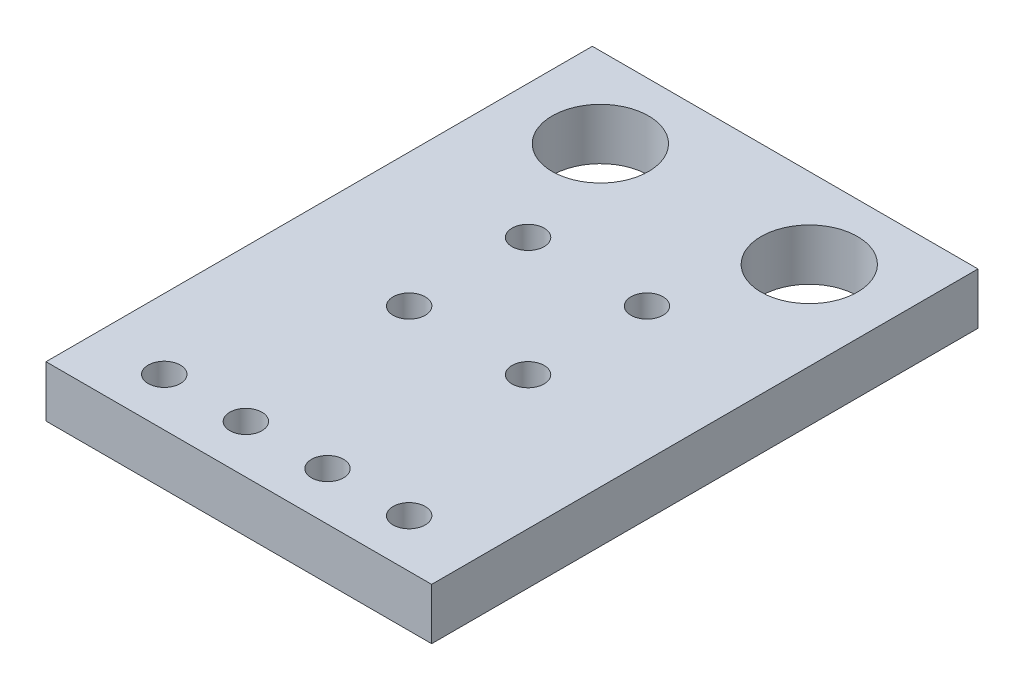
ISO-10303-21;
HEADER;
FILE_DESCRIPTION(('STEP AP214'),'2;1');
FILE_NAME('part.step','',(''),(''),'','','');
FILE_SCHEMA(('AUTOMOTIVE_DESIGN { 1 0 10303 214 1 1 1 1 }'));
ENDSEC;
DATA;
#1=APPLICATION_CONTEXT('core data for automotive mechanical design processes');
#2=APPLICATION_PROTOCOL_DEFINITION('international standard','automotive_design',2000,#1);
#3=PRODUCT_CONTEXT('',#1,'mechanical');
#4=PRODUCT('Part','Part','',(#3));
#5=PRODUCT_RELATED_PRODUCT_CATEGORY('part','',(#4));
#6=PRODUCT_DEFINITION_FORMATION('','',#4);
#7=PRODUCT_DEFINITION_CONTEXT('part definition',#1,'design');
#8=PRODUCT_DEFINITION('design','',#6,#7);
#9=PRODUCT_DEFINITION_SHAPE('','',#8);
#10=(LENGTH_UNIT() NAMED_UNIT(*) SI_UNIT(.MILLI.,.METRE.));
#11=(NAMED_UNIT(*) PLANE_ANGLE_UNIT() SI_UNIT($,.RADIAN.));
#12=(NAMED_UNIT(*) SI_UNIT($,.STERADIAN.) SOLID_ANGLE_UNIT());
#13=UNCERTAINTY_MEASURE_WITH_UNIT(LENGTH_MEASURE(1.E-05),#10,'distance_accuracy_value','');
#14=(GEOMETRIC_REPRESENTATION_CONTEXT(3) GLOBAL_UNCERTAINTY_ASSIGNED_CONTEXT((#13)) GLOBAL_UNIT_ASSIGNED_CONTEXT((#10,
#11,#12)) REPRESENTATION_CONTEXT('',''));
#15=CARTESIAN_POINT('',(0.,0.,0.));
#16=DIRECTION('',(0.,0.,1.));
#17=DIRECTION('',(1.,0.,0.));
#18=AXIS2_PLACEMENT_3D('',#15,#16,#17);
#19=CARTESIAN_POINT('',(0.,1.6,0.));
#20=DIRECTION('',(0.,1.,0.));
#21=DIRECTION('',(0.,0.,1.));
#22=AXIS2_PLACEMENT_3D('',#19,#20,#21);
#23=PLANE('',#22);
#24=CARTESIAN_POINT('',(1.85,1.6,9.85));
#25=DIRECTION('',(0.,1.,0.));
#26=DIRECTION('',(0.,0.,1.));
#27=AXIS2_PLACEMENT_3D('',#24,#25,#26);
#28=CIRCLE('',#27,0.5);
#29=CARTESIAN_POINT('',(1.85,1.6,10.35));
#30=VERTEX_POINT('',#29);
#31=EDGE_CURVE('E165',#30,#30,#28,.T.);
#32=ORIENTED_EDGE('',*,*,#31,.F.);
#33=EDGE_LOOP('',(#32));
#34=FACE_BOUND('',#33,.T.);
#35=CARTESIAN_POINT('',(-1.85,1.6,6.15));
#36=DIRECTION('',(0.,1.,0.));
#37=DIRECTION('',(0.,0.,1.));
#38=AXIS2_PLACEMENT_3D('',#35,#36,#37);
#39=CIRCLE('',#38,0.5);
#40=CARTESIAN_POINT('',(-1.85,1.6,6.65));
#41=VERTEX_POINT('',#40);
#42=EDGE_CURVE('E153',#41,#41,#39,.T.);
#43=ORIENTED_EDGE('',*,*,#42,.F.);
#44=EDGE_LOOP('',(#43));
#45=FACE_BOUND('',#44,.T.);
#46=CARTESIAN_POINT('',(1.26000000000001,1.6,15.5));
#47=DIRECTION('',(0.,1.,0.));
#48=DIRECTION('',(0.,0.,1.));
#49=AXIS2_PLACEMENT_3D('',#46,#47,#48);
#50=CIRCLE('',#49,0.5);
#51=CARTESIAN_POINT('',(1.26000000000001,1.6,16.));
#52=VERTEX_POINT('',#51);
#53=EDGE_CURVE('E141',#52,#52,#50,.T.);
#54=ORIENTED_EDGE('',*,*,#53,.F.);
#55=EDGE_LOOP('',(#54));
#56=FACE_BOUND('',#55,.T.);
#57=CARTESIAN_POINT('',(-3.81999999999999,1.6,15.5));
#58=DIRECTION('',(0.,1.,0.));
#59=DIRECTION('',(0.,0.,1.));
#60=AXIS2_PLACEMENT_3D('',#57,#58,#59);
#61=CIRCLE('',#60,0.500000000000001);
#62=CARTESIAN_POINT('',(-3.81999999999999,1.6,16.));
#63=VERTEX_POINT('',#62);
#64=EDGE_CURVE('E129',#63,#63,#61,.T.);
#65=ORIENTED_EDGE('',*,*,#64,.F.);
#66=EDGE_LOOP('',(#65));
#67=FACE_BOUND('',#66,.T.);
#68=CARTESIAN_POINT('',(-3.25,1.6,2.5));
#69=DIRECTION('',(0.,1.,0.));
#70=DIRECTION('',(0.,0.,1.));
#71=AXIS2_PLACEMENT_3D('',#68,#69,#70);
#72=CIRCLE('',#71,1.5);
#73=CARTESIAN_POINT('',(-3.25,1.6,4.));
#74=VERTEX_POINT('',#73);
#75=EDGE_CURVE('E108',#74,#74,#72,.T.);
#76=ORIENTED_EDGE('',*,*,#75,.F.);
#77=EDGE_LOOP('',(#76));
#78=FACE_BOUND('',#77,.T.);
#79=DIRECTION('',(0.,0.,1.));
#80=VECTOR('',#79,1.);
#81=CARTESIAN_POINT('',(-6.,1.6,0.));
#82=LINE('',#81,#80);
#83=CARTESIAN_POINT('',(-6.,1.6,0.));
#84=VERTEX_POINT('',#83);
#85=CARTESIAN_POINT('',(-6.,1.6,17.));
#86=VERTEX_POINT('',#85);
#87=EDGE_CURVE('E93',#84,#86,#82,.T.);
#88=ORIENTED_EDGE('',*,*,#87,.T.);
#89=DIRECTION('',(1.,0.,0.));
#90=VECTOR('',#89,1.);
#91=CARTESIAN_POINT('',(-6.,1.6,17.));
#92=LINE('',#91,#90);
#93=CARTESIAN_POINT('',(6.00000000000001,1.6,17.));
#94=VERTEX_POINT('',#93);
#95=EDGE_CURVE('E88',#86,#94,#92,.T.);
#96=ORIENTED_EDGE('',*,*,#95,.T.);
#97=DIRECTION('',(0.,0.,-1.));
#98=VECTOR('',#97,1.);
#99=CARTESIAN_POINT('',(6.,1.6,0.));
#100=LINE('',#99,#98);
#101=CARTESIAN_POINT('',(6.,1.6,0.));
#102=VERTEX_POINT('',#101);
#103=EDGE_CURVE('E91',#94,#102,#100,.T.);
#104=ORIENTED_EDGE('',*,*,#103,.T.);
#105=DIRECTION('',(-1.,0.,0.));
#106=VECTOR('',#105,1.);
#107=CARTESIAN_POINT('',(-6.,1.6,0.));
#108=LINE('',#107,#106);
#109=EDGE_CURVE('E58',#102,#84,#108,.T.);
#110=ORIENTED_EDGE('',*,*,#109,.T.);
#111=EDGE_LOOP('',(#88,#96,#104,#110));
#112=FACE_BOUND('',#111,.T.);
#113=CARTESIAN_POINT('',(3.25,1.6,2.5));
#114=DIRECTION('',(0.,1.,0.));
#115=DIRECTION('',(0.,0.,1.));
#116=AXIS2_PLACEMENT_3D('',#113,#114,#115);
#117=CIRCLE('',#116,1.5);
#118=CARTESIAN_POINT('',(3.25,1.6,4.));
#119=VERTEX_POINT('',#118);
#120=EDGE_CURVE('E123',#119,#119,#117,.T.);
#121=ORIENTED_EDGE('',*,*,#120,.F.);
#122=EDGE_LOOP('',(#121));
#123=FACE_BOUND('',#122,.T.);
#124=CARTESIAN_POINT('',(-1.27999999999999,1.6,15.5));
#125=DIRECTION('',(0.,1.,0.));
#126=DIRECTION('',(0.,0.,1.));
#127=AXIS2_PLACEMENT_3D('',#124,#125,#126);
#128=CIRCLE('',#127,0.500000000000002);
#129=CARTESIAN_POINT('',(-1.27999999999999,1.6,16.));
#130=VERTEX_POINT('',#129);
#131=EDGE_CURVE('E135',#130,#130,#128,.T.);
#132=ORIENTED_EDGE('',*,*,#131,.F.);
#133=EDGE_LOOP('',(#132));
#134=FACE_BOUND('',#133,.T.);
#135=CARTESIAN_POINT('',(3.80000000000001,1.6,15.5));
#136=DIRECTION('',(0.,1.,0.));
#137=DIRECTION('',(0.,0.,1.));
#138=AXIS2_PLACEMENT_3D('',#135,#136,#137);
#139=CIRCLE('',#138,0.500000000000002);
#140=CARTESIAN_POINT('',(3.80000000000001,1.6,16.));
#141=VERTEX_POINT('',#140);
#142=EDGE_CURVE('E147',#141,#141,#139,.T.);
#143=ORIENTED_EDGE('',*,*,#142,.F.);
#144=EDGE_LOOP('',(#143));
#145=FACE_BOUND('',#144,.T.);
#146=CARTESIAN_POINT('',(-1.85,1.6,9.85));
#147=DIRECTION('',(0.,1.,0.));
#148=DIRECTION('',(0.,0.,1.));
#149=AXIS2_PLACEMENT_3D('',#146,#147,#148);
#150=CIRCLE('',#149,0.5);
#151=CARTESIAN_POINT('',(-1.85,1.6,10.35));
#152=VERTEX_POINT('',#151);
#153=EDGE_CURVE('E159',#152,#152,#150,.T.);
#154=ORIENTED_EDGE('',*,*,#153,.F.);
#155=EDGE_LOOP('',(#154));
#156=FACE_BOUND('',#155,.T.);
#157=CARTESIAN_POINT('',(1.85,1.6,6.15));
#158=DIRECTION('',(0.,1.,0.));
#159=DIRECTION('',(0.,0.,1.));
#160=AXIS2_PLACEMENT_3D('',#157,#158,#159);
#161=CIRCLE('',#160,0.5);
#162=CARTESIAN_POINT('',(1.85,1.6,6.65));
#163=VERTEX_POINT('',#162);
#164=EDGE_CURVE('E171',#163,#163,#161,.T.);
#165=ORIENTED_EDGE('',*,*,#164,.F.);
#166=EDGE_LOOP('',(#165));
#167=FACE_BOUND('',#166,.T.);
#168=ADVANCED_FACE('F41',(#34,#45,#56,#67,#78,#112,#123,#134,#145,#156,#167),#23,.T.);
#169=CARTESIAN_POINT('',(0.,0.,0.));
#170=DIRECTION('',(0.,1.,0.));
#171=DIRECTION('',(0.,0.,1.));
#172=AXIS2_PLACEMENT_3D('',#169,#170,#171);
#173=PLANE('',#172);
#174=DIRECTION('',(0.,0.,1.));
#175=VECTOR('',#174,1.);
#176=CARTESIAN_POINT('',(-6.,0.,0.));
#177=LINE('',#176,#175);
#178=CARTESIAN_POINT('',(-6.,0.,0.));
#179=VERTEX_POINT('',#178);
#180=CARTESIAN_POINT('',(-6.,0.,17.));
#181=VERTEX_POINT('',#180);
#182=EDGE_CURVE('E105',#179,#181,#177,.T.);
#183=ORIENTED_EDGE('',*,*,#182,.F.);
#184=DIRECTION('',(-1.,0.,0.));
#185=VECTOR('',#184,1.);
#186=CARTESIAN_POINT('',(-6.,0.,0.));
#187=LINE('',#186,#185);
#188=CARTESIAN_POINT('',(6.,0.,0.));
#189=VERTEX_POINT('',#188);
#190=EDGE_CURVE('E81',#189,#179,#187,.T.);
#191=ORIENTED_EDGE('',*,*,#190,.F.);
#192=DIRECTION('',(0.,0.,-1.));
#193=VECTOR('',#192,1.);
#194=CARTESIAN_POINT('',(6.,0.,0.));
#195=LINE('',#194,#193);
#196=CARTESIAN_POINT('',(6.00000000000001,0.,17.));
#197=VERTEX_POINT('',#196);
#198=EDGE_CURVE('E75',#197,#189,#195,.T.);
#199=ORIENTED_EDGE('',*,*,#198,.F.);
#200=DIRECTION('',(1.,0.,0.));
#201=VECTOR('',#200,1.);
#202=CARTESIAN_POINT('',(-6.,0.,17.));
#203=LINE('',#202,#201);
#204=EDGE_CURVE('E97',#181,#197,#203,.T.);
#205=ORIENTED_EDGE('',*,*,#204,.F.);
#206=EDGE_LOOP('',(#183,#191,#199,#205));
#207=FACE_BOUND('',#206,.T.);
#208=CARTESIAN_POINT('',(-3.25,0.,2.5));
#209=DIRECTION('',(0.,1.,0.));
#210=DIRECTION('',(0.,0.,1.));
#211=AXIS2_PLACEMENT_3D('',#208,#209,#210);
#212=CIRCLE('',#211,1.5);
#213=CARTESIAN_POINT('',(-3.25,0.,4.));
#214=VERTEX_POINT('',#213);
#215=EDGE_CURVE('E120',#214,#214,#212,.T.);
#216=ORIENTED_EDGE('',*,*,#215,.T.);
#217=EDGE_LOOP('',(#216));
#218=FACE_BOUND('',#217,.T.);
#219=CARTESIAN_POINT('',(3.25,0.,2.5));
#220=DIRECTION('',(0.,1.,0.));
#221=DIRECTION('',(0.,0.,1.));
#222=AXIS2_PLACEMENT_3D('',#219,#220,#221);
#223=CIRCLE('',#222,1.5);
#224=CARTESIAN_POINT('',(3.25,0.,4.));
#225=VERTEX_POINT('',#224);
#226=EDGE_CURVE('E126',#225,#225,#223,.T.);
#227=ORIENTED_EDGE('',*,*,#226,.T.);
#228=EDGE_LOOP('',(#227));
#229=FACE_BOUND('',#228,.T.);
#230=CARTESIAN_POINT('',(-3.81999999999999,0.,15.5));
#231=DIRECTION('',(0.,1.,0.));
#232=DIRECTION('',(0.,0.,1.));
#233=AXIS2_PLACEMENT_3D('',#230,#231,#232);
#234=CIRCLE('',#233,0.500000000000001);
#235=CARTESIAN_POINT('',(-3.81999999999999,0.,16.));
#236=VERTEX_POINT('',#235);
#237=EDGE_CURVE('E132',#236,#236,#234,.T.);
#238=ORIENTED_EDGE('',*,*,#237,.T.);
#239=EDGE_LOOP('',(#238));
#240=FACE_BOUND('',#239,.T.);
#241=CARTESIAN_POINT('',(-1.27999999999999,0.,15.5));
#242=DIRECTION('',(0.,1.,0.));
#243=DIRECTION('',(0.,0.,1.));
#244=AXIS2_PLACEMENT_3D('',#241,#242,#243);
#245=CIRCLE('',#244,0.500000000000002);
#246=CARTESIAN_POINT('',(-1.27999999999999,0.,16.));
#247=VERTEX_POINT('',#246);
#248=EDGE_CURVE('E138',#247,#247,#245,.T.);
#249=ORIENTED_EDGE('',*,*,#248,.T.);
#250=EDGE_LOOP('',(#249));
#251=FACE_BOUND('',#250,.T.);
#252=CARTESIAN_POINT('',(1.26000000000001,0.,15.5));
#253=DIRECTION('',(0.,1.,0.));
#254=DIRECTION('',(0.,0.,1.));
#255=AXIS2_PLACEMENT_3D('',#252,#253,#254);
#256=CIRCLE('',#255,0.5);
#257=CARTESIAN_POINT('',(1.26000000000001,0.,16.));
#258=VERTEX_POINT('',#257);
#259=EDGE_CURVE('E144',#258,#258,#256,.T.);
#260=ORIENTED_EDGE('',*,*,#259,.T.);
#261=EDGE_LOOP('',(#260));
#262=FACE_BOUND('',#261,.T.);
#263=CARTESIAN_POINT('',(3.80000000000001,0.,15.5));
#264=DIRECTION('',(0.,1.,0.));
#265=DIRECTION('',(0.,0.,1.));
#266=AXIS2_PLACEMENT_3D('',#263,#264,#265);
#267=CIRCLE('',#266,0.500000000000002);
#268=CARTESIAN_POINT('',(3.80000000000001,0.,16.));
#269=VERTEX_POINT('',#268);
#270=EDGE_CURVE('E150',#269,#269,#267,.T.);
#271=ORIENTED_EDGE('',*,*,#270,.T.);
#272=EDGE_LOOP('',(#271));
#273=FACE_BOUND('',#272,.T.);
#274=CARTESIAN_POINT('',(-1.85,0.,6.15));
#275=DIRECTION('',(0.,1.,0.));
#276=DIRECTION('',(0.,0.,1.));
#277=AXIS2_PLACEMENT_3D('',#274,#275,#276);
#278=CIRCLE('',#277,0.5);
#279=CARTESIAN_POINT('',(-1.85,0.,6.65));
#280=VERTEX_POINT('',#279);
#281=EDGE_CURVE('E156',#280,#280,#278,.T.);
#282=ORIENTED_EDGE('',*,*,#281,.T.);
#283=EDGE_LOOP('',(#282));
#284=FACE_BOUND('',#283,.T.);
#285=CARTESIAN_POINT('',(-1.85,0.,9.85));
#286=DIRECTION('',(0.,1.,0.));
#287=DIRECTION('',(0.,0.,1.));
#288=AXIS2_PLACEMENT_3D('',#285,#286,#287);
#289=CIRCLE('',#288,0.5);
#290=CARTESIAN_POINT('',(-1.85,0.,10.35));
#291=VERTEX_POINT('',#290);
#292=EDGE_CURVE('E162',#291,#291,#289,.T.);
#293=ORIENTED_EDGE('',*,*,#292,.T.);
#294=EDGE_LOOP('',(#293));
#295=FACE_BOUND('',#294,.T.);
#296=CARTESIAN_POINT('',(1.85,0.,9.85));
#297=DIRECTION('',(0.,1.,0.));
#298=DIRECTION('',(0.,0.,1.));
#299=AXIS2_PLACEMENT_3D('',#296,#297,#298);
#300=CIRCLE('',#299,0.5);
#301=CARTESIAN_POINT('',(1.85,0.,10.35));
#302=VERTEX_POINT('',#301);
#303=EDGE_CURVE('E168',#302,#302,#300,.T.);
#304=ORIENTED_EDGE('',*,*,#303,.T.);
#305=EDGE_LOOP('',(#304));
#306=FACE_BOUND('',#305,.T.);
#307=CARTESIAN_POINT('',(1.85,0.,6.15));
#308=DIRECTION('',(0.,1.,0.));
#309=DIRECTION('',(0.,0.,1.));
#310=AXIS2_PLACEMENT_3D('',#307,#308,#309);
#311=CIRCLE('',#310,0.5);
#312=CARTESIAN_POINT('',(1.85,0.,6.65));
#313=VERTEX_POINT('',#312);
#314=EDGE_CURVE('E174',#313,#313,#311,.T.);
#315=ORIENTED_EDGE('',*,*,#314,.T.);
#316=EDGE_LOOP('',(#315));
#317=FACE_BOUND('',#316,.T.);
#318=ADVANCED_FACE('F116',(#207,#218,#229,#240,#251,#262,#273,#284,#295,#306,#317),#173,.F.);
#319=CARTESIAN_POINT('',(-6.,1.6,0.));
#320=DIRECTION('',(1.,0.,0.));
#321=DIRECTION('',(0.,0.,-1.));
#322=AXIS2_PLACEMENT_3D('',#319,#320,#321);
#323=PLANE('',#322);
#324=ORIENTED_EDGE('',*,*,#182,.T.);
#325=DIRECTION('',(0.,-1.,0.));
#326=VECTOR('',#325,1.);
#327=CARTESIAN_POINT('',(-6.,1.6,17.));
#328=LINE('',#327,#326);
#329=EDGE_CURVE('E11',#86,#181,#328,.T.);
#330=ORIENTED_EDGE('',*,*,#329,.F.);
#331=ORIENTED_EDGE('',*,*,#87,.F.);
#332=DIRECTION('',(0.,-1.,0.));
#333=VECTOR('',#332,1.);
#334=CARTESIAN_POINT('',(-6.,1.6,0.));
#335=LINE('',#334,#333);
#336=EDGE_CURVE('E101',#84,#179,#335,.T.);
#337=ORIENTED_EDGE('',*,*,#336,.T.);
#338=EDGE_LOOP('',(#324,#330,#331,#337));
#339=FACE_BOUND('',#338,.T.);
#340=ADVANCED_FACE('F43',(#339),#323,.F.);
#341=CARTESIAN_POINT('',(-6.,1.6,17.));
#342=DIRECTION('',(0.,0.,-1.));
#343=DIRECTION('',(-1.,0.,0.));
#344=AXIS2_PLACEMENT_3D('',#341,#342,#343);
#345=PLANE('',#344);
#346=ORIENTED_EDGE('',*,*,#204,.T.);
#347=DIRECTION('',(0.,-1.,0.));
#348=VECTOR('',#347,1.);
#349=CARTESIAN_POINT('',(6.00000000000001,1.6,17.));
#350=LINE('',#349,#348);
#351=EDGE_CURVE('E50',#94,#197,#350,.T.);
#352=ORIENTED_EDGE('',*,*,#351,.F.);
#353=ORIENTED_EDGE('',*,*,#95,.F.);
#354=ORIENTED_EDGE('',*,*,#329,.T.);
#355=EDGE_LOOP('',(#346,#352,#353,#354));
#356=FACE_BOUND('',#355,.T.);
#357=ADVANCED_FACE('F96',(#356),#345,.F.);
#358=CARTESIAN_POINT('',(6.,1.6,0.));
#359=DIRECTION('',(-1.,0.,0.));
#360=DIRECTION('',(0.,0.,1.));
#361=AXIS2_PLACEMENT_3D('',#358,#359,#360);
#362=PLANE('',#361);
#363=ORIENTED_EDGE('',*,*,#198,.T.);
#364=DIRECTION('',(0.,-1.,0.));
#365=VECTOR('',#364,1.);
#366=CARTESIAN_POINT('',(6.,1.6,0.));
#367=LINE('',#366,#365);
#368=EDGE_CURVE('E98',#102,#189,#367,.T.);
#369=ORIENTED_EDGE('',*,*,#368,.F.);
#370=ORIENTED_EDGE('',*,*,#103,.F.);
#371=ORIENTED_EDGE('',*,*,#351,.T.);
#372=EDGE_LOOP('',(#363,#369,#370,#371));
#373=FACE_BOUND('',#372,.T.);
#374=ADVANCED_FACE('F99',(#373),#362,.F.);
#375=CARTESIAN_POINT('',(-6.,1.6,0.));
#376=DIRECTION('',(0.,0.,1.));
#377=DIRECTION('',(1.,0.,0.));
#378=AXIS2_PLACEMENT_3D('',#375,#376,#377);
#379=PLANE('',#378);
#380=ORIENTED_EDGE('',*,*,#190,.T.);
#381=ORIENTED_EDGE('',*,*,#336,.F.);
#382=ORIENTED_EDGE('',*,*,#109,.F.);
#383=ORIENTED_EDGE('',*,*,#368,.T.);
#384=EDGE_LOOP('',(#380,#381,#382,#383));
#385=FACE_BOUND('',#384,.T.);
#386=ADVANCED_FACE('F113',(#385),#379,.F.);
#387=CARTESIAN_POINT('',(-3.25,1.6,2.5));
#388=DIRECTION('',(0.,-1.,0.));
#389=DIRECTION('',(0.,0.,-1.));
#390=AXIS2_PLACEMENT_3D('',#387,#388,#389);
#391=CYLINDRICAL_SURFACE('',#390,1.5);
#392=ORIENTED_EDGE('',*,*,#75,.T.);
#393=EDGE_LOOP('',(#392));
#394=FACE_BOUND('',#393,.T.);
#395=ORIENTED_EDGE('',*,*,#215,.F.);
#396=EDGE_LOOP('',(#395));
#397=FACE_BOUND('',#396,.T.);
#398=ADVANCED_FACE('F193',(#394,#397),#391,.F.);
#399=CARTESIAN_POINT('',(3.25,1.6,2.5));
#400=DIRECTION('',(0.,-1.,0.));
#401=DIRECTION('',(0.,0.,-1.));
#402=AXIS2_PLACEMENT_3D('',#399,#400,#401);
#403=CYLINDRICAL_SURFACE('',#402,1.5);
#404=ORIENTED_EDGE('',*,*,#120,.T.);
#405=EDGE_LOOP('',(#404));
#406=FACE_BOUND('',#405,.T.);
#407=ORIENTED_EDGE('',*,*,#226,.F.);
#408=EDGE_LOOP('',(#407));
#409=FACE_BOUND('',#408,.T.);
#410=ADVANCED_FACE('F256',(#406,#409),#403,.F.);
#411=CARTESIAN_POINT('',(-3.81999999999999,1.6,15.5));
#412=DIRECTION('',(0.,-1.,0.));
#413=DIRECTION('',(0.,0.,-1.));
#414=AXIS2_PLACEMENT_3D('',#411,#412,#413);
#415=CYLINDRICAL_SURFACE('',#414,0.500000000000001);
#416=ORIENTED_EDGE('',*,*,#64,.T.);
#417=EDGE_LOOP('',(#416));
#418=FACE_BOUND('',#417,.T.);
#419=ORIENTED_EDGE('',*,*,#237,.F.);
#420=EDGE_LOOP('',(#419));
#421=FACE_BOUND('',#420,.T.);
#422=ADVANCED_FACE('F266',(#418,#421),#415,.F.);
#423=CARTESIAN_POINT('',(-1.27999999999999,1.6,15.5));
#424=DIRECTION('',(0.,-1.,0.));
#425=DIRECTION('',(0.,0.,-1.));
#426=AXIS2_PLACEMENT_3D('',#423,#424,#425);
#427=CYLINDRICAL_SURFACE('',#426,0.500000000000002);
#428=ORIENTED_EDGE('',*,*,#131,.T.);
#429=EDGE_LOOP('',(#428));
#430=FACE_BOUND('',#429,.T.);
#431=ORIENTED_EDGE('',*,*,#248,.F.);
#432=EDGE_LOOP('',(#431));
#433=FACE_BOUND('',#432,.T.);
#434=ADVANCED_FACE('F276',(#430,#433),#427,.F.);
#435=CARTESIAN_POINT('',(1.26000000000001,1.6,15.5));
#436=DIRECTION('',(0.,-1.,0.));
#437=DIRECTION('',(0.,0.,-1.));
#438=AXIS2_PLACEMENT_3D('',#435,#436,#437);
#439=CYLINDRICAL_SURFACE('',#438,0.5);
#440=ORIENTED_EDGE('',*,*,#53,.T.);
#441=EDGE_LOOP('',(#440));
#442=FACE_BOUND('',#441,.T.);
#443=ORIENTED_EDGE('',*,*,#259,.F.);
#444=EDGE_LOOP('',(#443));
#445=FACE_BOUND('',#444,.T.);
#446=ADVANCED_FACE('F287',(#442,#445),#439,.F.);
#447=CARTESIAN_POINT('',(3.80000000000001,1.6,15.5));
#448=DIRECTION('',(0.,-1.,0.));
#449=DIRECTION('',(0.,0.,-1.));
#450=AXIS2_PLACEMENT_3D('',#447,#448,#449);
#451=CYLINDRICAL_SURFACE('',#450,0.500000000000002);
#452=ORIENTED_EDGE('',*,*,#142,.T.);
#453=EDGE_LOOP('',(#452));
#454=FACE_BOUND('',#453,.T.);
#455=ORIENTED_EDGE('',*,*,#270,.F.);
#456=EDGE_LOOP('',(#455));
#457=FACE_BOUND('',#456,.T.);
#458=ADVANCED_FACE('F298',(#454,#457),#451,.F.);
#459=CARTESIAN_POINT('',(-1.85,1.6,6.15));
#460=DIRECTION('',(0.,-1.,0.));
#461=DIRECTION('',(0.,0.,-1.));
#462=AXIS2_PLACEMENT_3D('',#459,#460,#461);
#463=CYLINDRICAL_SURFACE('',#462,0.5);
#464=ORIENTED_EDGE('',*,*,#42,.T.);
#465=EDGE_LOOP('',(#464));
#466=FACE_BOUND('',#465,.T.);
#467=ORIENTED_EDGE('',*,*,#281,.F.);
#468=EDGE_LOOP('',(#467));
#469=FACE_BOUND('',#468,.T.);
#470=ADVANCED_FACE('F309',(#466,#469),#463,.F.);
#471=CARTESIAN_POINT('',(-1.85,1.6,9.85));
#472=DIRECTION('',(0.,-1.,0.));
#473=DIRECTION('',(0.,0.,-1.));
#474=AXIS2_PLACEMENT_3D('',#471,#472,#473);
#475=CYLINDRICAL_SURFACE('',#474,0.5);
#476=ORIENTED_EDGE('',*,*,#153,.T.);
#477=EDGE_LOOP('',(#476));
#478=FACE_BOUND('',#477,.T.);
#479=ORIENTED_EDGE('',*,*,#292,.F.);
#480=EDGE_LOOP('',(#479));
#481=FACE_BOUND('',#480,.T.);
#482=ADVANCED_FACE('F320',(#478,#481),#475,.F.);
#483=CARTESIAN_POINT('',(1.85,1.6,9.85));
#484=DIRECTION('',(0.,-1.,0.));
#485=DIRECTION('',(0.,0.,-1.));
#486=AXIS2_PLACEMENT_3D('',#483,#484,#485);
#487=CYLINDRICAL_SURFACE('',#486,0.5);
#488=ORIENTED_EDGE('',*,*,#31,.T.);
#489=EDGE_LOOP('',(#488));
#490=FACE_BOUND('',#489,.T.);
#491=ORIENTED_EDGE('',*,*,#303,.F.);
#492=EDGE_LOOP('',(#491));
#493=FACE_BOUND('',#492,.T.);
#494=ADVANCED_FACE('F331',(#490,#493),#487,.F.);
#495=CARTESIAN_POINT('',(1.85,1.6,6.15));
#496=DIRECTION('',(0.,-1.,0.));
#497=DIRECTION('',(0.,0.,-1.));
#498=AXIS2_PLACEMENT_3D('',#495,#496,#497);
#499=CYLINDRICAL_SURFACE('',#498,0.5);
#500=ORIENTED_EDGE('',*,*,#164,.T.);
#501=EDGE_LOOP('',(#500));
#502=FACE_BOUND('',#501,.T.);
#503=ORIENTED_EDGE('',*,*,#314,.F.);
#504=EDGE_LOOP('',(#503));
#505=FACE_BOUND('',#504,.T.);
#506=ADVANCED_FACE('F180',(#502,#505),#499,.F.);
#507=CLOSED_SHELL('',(#168,#318,#340,#357,#374,#386,#398,#410,#422,#434,#446,#458,#470,#482,
#494,#506));
#508=MANIFOLD_SOLID_BREP('B2',#507);
#509=ADVANCED_BREP_SHAPE_REPRESENTATION('',(#18,#508),#14);
#510=SHAPE_DEFINITION_REPRESENTATION(#9,#509);
ENDSEC;
END-ISO-10303-21;
